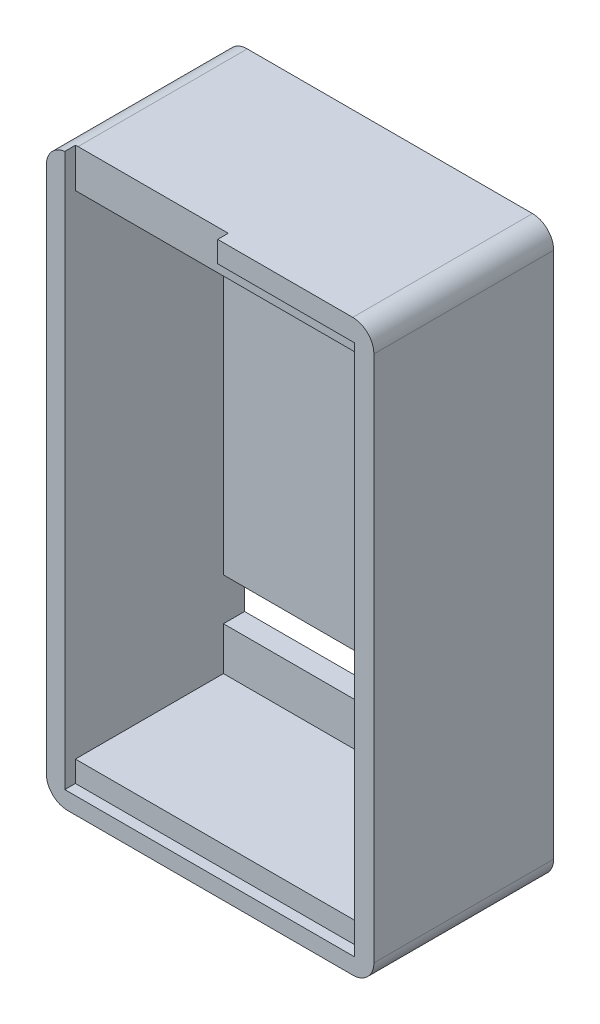
ISO-10303-21;
HEADER;
FILE_DESCRIPTION(('STEP AP214'),'2;1');
FILE_NAME('part.step','',(''),(''),'','','');
FILE_SCHEMA(('AUTOMOTIVE_DESIGN { 1 0 10303 214 1 1 1 1 }'));
ENDSEC;
DATA;
#1=APPLICATION_CONTEXT('core data for automotive mechanical design processes');
#2=APPLICATION_PROTOCOL_DEFINITION('international standard','automotive_design',2000,#1);
#3=PRODUCT_CONTEXT('',#1,'mechanical');
#4=PRODUCT('Part','Part','',(#3));
#5=PRODUCT_RELATED_PRODUCT_CATEGORY('part','',(#4));
#6=PRODUCT_DEFINITION_FORMATION('','',#4);
#7=PRODUCT_DEFINITION_CONTEXT('part definition',#1,'design');
#8=PRODUCT_DEFINITION('design','',#6,#7);
#9=PRODUCT_DEFINITION_SHAPE('','',#8);
#10=(LENGTH_UNIT() NAMED_UNIT(*) SI_UNIT(.MILLI.,.METRE.));
#11=(NAMED_UNIT(*) PLANE_ANGLE_UNIT() SI_UNIT($,.RADIAN.));
#12=(NAMED_UNIT(*) SI_UNIT($,.STERADIAN.) SOLID_ANGLE_UNIT());
#13=UNCERTAINTY_MEASURE_WITH_UNIT(LENGTH_MEASURE(1.E-05),#10,'distance_accuracy_value','');
#14=(GEOMETRIC_REPRESENTATION_CONTEXT(3) GLOBAL_UNCERTAINTY_ASSIGNED_CONTEXT((#13)) GLOBAL_UNIT_ASSIGNED_CONTEXT((#10,
#11,#12)) REPRESENTATION_CONTEXT('',''));
#15=CARTESIAN_POINT('',(0.,0.,0.));
#16=DIRECTION('',(0.,0.,1.));
#17=DIRECTION('',(1.,0.,0.));
#18=AXIS2_PLACEMENT_3D('',#15,#16,#17);
#19=CARTESIAN_POINT('',(0.,0.,2.));
#20=DIRECTION('',(0.,0.,-1.));
#21=DIRECTION('',(-1.,0.,0.));
#22=AXIS2_PLACEMENT_3D('',#19,#20,#21);
#23=PLANE('',#22);
#24=DIRECTION('',(1.,0.,0.));
#25=VECTOR('',#24,1.);
#26=CARTESIAN_POINT('',(38.4138867747377,-36.8271145490556,2.));
#27=LINE('',#26,#25);
#28=CARTESIAN_POINT('',(38.4138867747377,-36.8271145490556,2.));
#29=VERTEX_POINT('',#28);
#30=CARTESIAN_POINT('',(65.7954731172423,-36.8271145490556,2.));
#31=VERTEX_POINT('',#30);
#32=EDGE_CURVE('E213',#29,#31,#27,.T.);
#33=ORIENTED_EDGE('',*,*,#32,.F.);
#34=DIRECTION('',(0.,-1.,0.));
#35=VECTOR('',#34,1.);
#36=CARTESIAN_POINT('',(38.4138867747377,-77.1753131264585,2.));
#37=LINE('',#36,#35);
#38=CARTESIAN_POINT('',(38.4138867747377,-67.0903285254417,2.));
#39=VERTEX_POINT('',#38);
#40=EDGE_CURVE('E225',#29,#39,#37,.T.);
#41=ORIENTED_EDGE('',*,*,#40,.T.);
#42=DIRECTION('',(-1.,0.,0.));
#43=VECTOR('',#42,1.);
#44=CARTESIAN_POINT('',(38.4138867747377,-67.0903285254417,2.));
#45=LINE('',#44,#43);
#46=CARTESIAN_POINT('',(65.7954731172423,-67.0903285254417,2.));
#47=VERTEX_POINT('',#46);
#48=EDGE_CURVE('E354',#47,#39,#45,.T.);
#49=ORIENTED_EDGE('',*,*,#48,.F.);
#50=DIRECTION('',(0.,1.,0.));
#51=VECTOR('',#50,1.);
#52=CARTESIAN_POINT('',(65.7954731172423,-26.6161419497379,2.));
#53=LINE('',#52,#51);
#54=EDGE_CURVE('E227',#47,#31,#53,.T.);
#55=ORIENTED_EDGE('',*,*,#54,.T.);
#56=EDGE_LOOP('',(#33,#41,#49,#55));
#57=FACE_BOUND('',#56,.T.);
#58=ADVANCED_FACE('F35',(#57),#23,.F.);
#59=DIRECTION('',(-1.,0.,0.));
#60=VECTOR('',#59,1.);
#61=CARTESIAN_POINT('',(38.4138867747377,-32.8271145490556,2.));
#62=LINE('',#61,#60);
#63=CARTESIAN_POINT('',(65.7954731172423,-32.8271145490556,2.));
#64=VERTEX_POINT('',#63);
#65=CARTESIAN_POINT('',(38.4138867747377,-32.8271145490556,2.));
#66=VERTEX_POINT('',#65);
#67=EDGE_CURVE('E220',#64,#66,#62,.T.);
#68=ORIENTED_EDGE('',*,*,#67,.F.);
#69=CARTESIAN_POINT('',(65.7954731172423,-28.6161419497379,2.));
#70=VERTEX_POINT('',#69);
#71=EDGE_CURVE('E252',#64,#70,#53,.T.);
#72=ORIENTED_EDGE('',*,*,#71,.T.);
#73=DIRECTION('',(1.,0.,0.));
#74=VECTOR('',#73,1.);
#75=CARTESIAN_POINT('',(38.4138867747377,-28.6161419497379,2.));
#76=LINE('',#75,#74);
#77=CARTESIAN_POINT('',(38.4138867747377,-28.6161419497379,2.));
#78=VERTEX_POINT('',#77);
#79=EDGE_CURVE('E407',#78,#70,#76,.T.);
#80=ORIENTED_EDGE('',*,*,#79,.F.);
#81=EDGE_CURVE('E235',#78,#66,#37,.T.);
#82=ORIENTED_EDGE('',*,*,#81,.T.);
#83=EDGE_LOOP('',(#68,#72,#80,#82));
#84=FACE_BOUND('',#83,.T.);
#85=ADVANCED_FACE('F428',(#84),#23,.F.);
#86=DIRECTION('',(1.,0.,0.));
#87=VECTOR('',#86,1.);
#88=CARTESIAN_POINT('',(38.4138867747377,-71.0903285254417,2.));
#89=LINE('',#88,#87);
#90=CARTESIAN_POINT('',(38.4138867747377,-71.0903285254417,2.));
#91=VERTEX_POINT('',#90);
#92=CARTESIAN_POINT('',(65.7954731172423,-71.0903285254417,2.));
#93=VERTEX_POINT('',#92);
#94=EDGE_CURVE('E356',#91,#93,#89,.T.);
#95=ORIENTED_EDGE('',*,*,#94,.F.);
#96=CARTESIAN_POINT('',(38.4138867747377,-75.1753131264585,2.));
#97=VERTEX_POINT('',#96);
#98=EDGE_CURVE('E236',#91,#97,#37,.T.);
#99=ORIENTED_EDGE('',*,*,#98,.T.);
#100=DIRECTION('',(-1.,0.,0.));
#101=VECTOR('',#100,1.);
#102=CARTESIAN_POINT('',(38.4138867747377,-75.1753131264585,2.));
#103=LINE('',#102,#101);
#104=CARTESIAN_POINT('',(65.7954731172423,-75.1753131264585,2.));
#105=VERTEX_POINT('',#104);
#106=EDGE_CURVE('E386',#105,#97,#103,.T.);
#107=ORIENTED_EDGE('',*,*,#106,.F.);
#108=EDGE_CURVE('E240',#105,#93,#53,.T.);
#109=ORIENTED_EDGE('',*,*,#108,.T.);
#110=EDGE_LOOP('',(#95,#99,#107,#109));
#111=FACE_BOUND('',#110,.T.);
#112=ADVANCED_FACE('F457',(#111),#23,.F.);
#113=CARTESIAN_POINT('',(65.7954731172423,-26.6161419497379,2.));
#114=DIRECTION('',(1.,0.,0.));
#115=DIRECTION('',(0.,0.,-1.));
#116=AXIS2_PLACEMENT_3D('',#113,#114,#115);
#117=PLANE('',#116);
#118=DIRECTION('',(0.,0.,1.));
#119=VECTOR('',#118,1.);
#120=CARTESIAN_POINT('',(65.7954731172423,-26.8876513413796,2.));
#121=LINE('',#120,#119);
#122=CARTESIAN_POINT('',(65.7954731172423,-26.8876513413796,16.));
#123=VERTEX_POINT('',#122);
#124=CARTESIAN_POINT('',(65.7954731172423,-26.8876513413796,17.));
#125=VERTEX_POINT('',#124);
#126=EDGE_CURVE('E374',#123,#125,#121,.T.);
#127=ORIENTED_EDGE('',*,*,#126,.F.);
#128=DIRECTION('',(0.,1.,0.));
#129=VECTOR('',#128,1.);
#130=CARTESIAN_POINT('',(65.7954731172423,-26.6161419497379,16.));
#131=LINE('',#130,#129);
#132=CARTESIAN_POINT('',(65.7954731172423,-28.6161419497379,16.));
#133=VERTEX_POINT('',#132);
#134=EDGE_CURVE('E413',#133,#123,#131,.T.);
#135=ORIENTED_EDGE('',*,*,#134,.F.);
#136=DIRECTION('',(0.,0.,-1.));
#137=VECTOR('',#136,1.);
#138=CARTESIAN_POINT('',(65.7954731172423,-28.6161419497379,16.));
#139=LINE('',#138,#137);
#140=EDGE_CURVE('E416',#133,#70,#139,.T.);
#141=ORIENTED_EDGE('',*,*,#140,.T.);
#142=ORIENTED_EDGE('',*,*,#71,.F.);
#143=DIRECTION('',(0.,0.,1.));
#144=VECTOR('',#143,1.);
#145=CARTESIAN_POINT('',(65.7954731172423,-32.8271145490556,-8.));
#146=LINE('',#145,#144);
#147=CARTESIAN_POINT('',(65.7954731172423,-32.8271145490556,0.));
#148=VERTEX_POINT('',#147);
#149=EDGE_CURVE('E58',#148,#64,#146,.T.);
#150=ORIENTED_EDGE('',*,*,#149,.F.);
#151=DIRECTION('',(0.,1.,0.));
#152=VECTOR('',#151,1.);
#153=CARTESIAN_POINT('',(65.7954731172423,0.,0.));
#154=LINE('',#153,#152);
#155=CARTESIAN_POINT('',(65.7954731172423,-36.8271145490556,0.));
#156=VERTEX_POINT('',#155);
#157=EDGE_CURVE('E334',#156,#148,#154,.T.);
#158=ORIENTED_EDGE('',*,*,#157,.F.);
#159=DIRECTION('',(0.,0.,1.));
#160=VECTOR('',#159,1.);
#161=CARTESIAN_POINT('',(65.7954731172423,-36.8271145490556,-8.));
#162=LINE('',#161,#160);
#163=EDGE_CURVE('E219',#156,#31,#162,.T.);
#164=ORIENTED_EDGE('',*,*,#163,.T.);
#165=ORIENTED_EDGE('',*,*,#54,.F.);
#166=DIRECTION('',(0.,0.,1.));
#167=VECTOR('',#166,1.);
#168=CARTESIAN_POINT('',(65.7954731172423,-67.0903285254417,-8.));
#169=LINE('',#168,#167);
#170=CARTESIAN_POINT('',(65.7954731172423,-67.0903285254417,0.));
#171=VERTEX_POINT('',#170);
#172=EDGE_CURVE('E358',#171,#47,#169,.T.);
#173=ORIENTED_EDGE('',*,*,#172,.F.);
#174=DIRECTION('',(0.,1.,0.));
#175=VECTOR('',#174,1.);
#176=CARTESIAN_POINT('',(65.7954731172423,0.,0.));
#177=LINE('',#176,#175);
#178=CARTESIAN_POINT('',(65.7954731172423,-71.0903285254417,0.));
#179=VERTEX_POINT('',#178);
#180=EDGE_CURVE('E330',#179,#171,#177,.T.);
#181=ORIENTED_EDGE('',*,*,#180,.F.);
#182=DIRECTION('',(0.,0.,1.));
#183=VECTOR('',#182,1.);
#184=CARTESIAN_POINT('',(65.7954731172423,-71.0903285254417,-8.));
#185=LINE('',#184,#183);
#186=EDGE_CURVE('E228',#179,#93,#185,.T.);
#187=ORIENTED_EDGE('',*,*,#186,.T.);
#188=ORIENTED_EDGE('',*,*,#108,.F.);
#189=DIRECTION('',(0.,0.,-1.));
#190=VECTOR('',#189,1.);
#191=CARTESIAN_POINT('',(65.7954731172423,-75.1753131264585,16.));
#192=LINE('',#191,#190);
#193=CARTESIAN_POINT('',(65.7954731172423,-75.1753131264585,16.));
#194=VERTEX_POINT('',#193);
#195=EDGE_CURVE('E404',#194,#105,#192,.T.);
#196=ORIENTED_EDGE('',*,*,#195,.F.);
#197=DIRECTION('',(0.,1.,0.));
#198=VECTOR('',#197,1.);
#199=CARTESIAN_POINT('',(65.7954731172423,-77.1753131264585,16.));
#200=LINE('',#199,#198);
#201=CARTESIAN_POINT('',(65.7954731172423,-77.1753131264585,16.));
#202=VERTEX_POINT('',#201);
#203=EDGE_CURVE('E393',#202,#194,#200,.T.);
#204=ORIENTED_EDGE('',*,*,#203,.F.);
#205=DIRECTION('',(0.,0.,1.));
#206=VECTOR('',#205,1.);
#207=CARTESIAN_POINT('',(65.7954731172423,-77.1753131264585,2.));
#208=LINE('',#207,#206);
#209=CARTESIAN_POINT('',(65.7954731172423,-77.1753131264585,17.));
#210=VERTEX_POINT('',#209);
#211=EDGE_CURVE('E253',#202,#210,#208,.T.);
#212=ORIENTED_EDGE('',*,*,#211,.T.);
#213=DIRECTION('',(0.,1.,0.));
#214=VECTOR('',#213,1.);
#215=CARTESIAN_POINT('',(65.7954731172423,-26.6161419497379,17.));
#216=LINE('',#215,#214);
#217=EDGE_CURVE('E244',#210,#125,#216,.T.);
#218=ORIENTED_EDGE('',*,*,#217,.T.);
#219=EDGE_LOOP('',(#127,#135,#141,#142,#150,#158,#164,#165,#173,#181,#187,#188,#196,#204,#212,#218));
#220=FACE_BOUND('',#219,.T.);
#221=ADVANCED_FACE('F346',(#220),#117,.F.);
#222=CARTESIAN_POINT('',(0.,0.,16.));
#223=DIRECTION('',(0.,0.,1.));
#224=DIRECTION('',(1.,0.,0.));
#225=AXIS2_PLACEMENT_3D('',#222,#223,#224);
#226=PLANE('',#225);
#227=DIRECTION('',(-1.,0.,0.));
#228=VECTOR('',#227,1.);
#229=CARTESIAN_POINT('',(38.4138867747377,-24.8876513413796,16.));
#230=LINE('',#229,#228);
#231=CARTESIAN_POINT('',(52.8696418024731,-24.8876513413796,16.));
#232=VERTEX_POINT('',#231);
#233=CARTESIAN_POINT('',(38.6667067876056,-24.8876513413796,16.));
#234=VERTEX_POINT('',#233);
#235=EDGE_CURVE('E383',#232,#234,#230,.T.);
#236=ORIENTED_EDGE('',*,*,#235,.T.);
#237=CARTESIAN_POINT('',(38.6667067876056,-26.8876513413796,16.));
#238=DIRECTION('',(0.,0.,1.));
#239=DIRECTION('',(1.,0.,0.));
#240=AXIS2_PLACEMENT_3D('',#237,#238,#239);
#241=CIRCLE('',#240,2.);
#242=CARTESIAN_POINT('',(38.4138867747377,-24.9036951823142,16.));
#243=VERTEX_POINT('',#242);
#244=EDGE_CURVE('E317',#234,#243,#241,.T.);
#245=ORIENTED_EDGE('',*,*,#244,.T.);
#246=DIRECTION('',(0.,-1.,0.));
#247=VECTOR('',#246,1.);
#248=CARTESIAN_POINT('',(38.4138867747377,-26.6161419497379,16.));
#249=LINE('',#248,#247);
#250=CARTESIAN_POINT('',(38.4138867747377,-28.6161419497379,16.));
#251=VERTEX_POINT('',#250);
#252=EDGE_CURVE('E408',#243,#251,#249,.T.);
#253=ORIENTED_EDGE('',*,*,#252,.T.);
#254=DIRECTION('',(1.,0.,0.));
#255=VECTOR('',#254,1.);
#256=CARTESIAN_POINT('',(38.4138867747377,-28.6161419497379,16.));
#257=LINE('',#256,#255);
#258=EDGE_CURVE('E410',#251,#133,#257,.T.);
#259=ORIENTED_EDGE('',*,*,#258,.T.);
#260=ORIENTED_EDGE('',*,*,#134,.T.);
#261=DIRECTION('',(1.,0.,0.));
#262=VECTOR('',#261,1.);
#263=CARTESIAN_POINT('',(65.8048441622965,-26.8876513413796,16.));
#264=LINE('',#263,#262);
#265=CARTESIAN_POINT('',(52.8696418024731,-26.8876513413796,16.));
#266=VERTEX_POINT('',#265);
#267=EDGE_CURVE('E363',#266,#123,#264,.T.);
#268=ORIENTED_EDGE('',*,*,#267,.F.);
#269=DIRECTION('',(0.,-1.,0.));
#270=VECTOR('',#269,1.);
#271=CARTESIAN_POINT('',(52.8696418024731,-24.8876513413796,16.));
#272=LINE('',#271,#270);
#273=EDGE_CURVE('E368',#232,#266,#272,.T.);
#274=ORIENTED_EDGE('',*,*,#273,.F.);
#275=EDGE_LOOP('',(#236,#245,#253,#259,#260,#268,#274));
#276=FACE_BOUND('',#275,.T.);
#277=ADVANCED_FACE('F430',(#276),#226,.T.);
#278=CARTESIAN_POINT('',(38.4138867747377,-77.1753131264585,2.));
#279=DIRECTION('',(-1.,0.,0.));
#280=DIRECTION('',(0.,0.,1.));
#281=AXIS2_PLACEMENT_3D('',#278,#279,#280);
#282=PLANE('',#281);
#283=ORIENTED_EDGE('',*,*,#252,.F.);
#284=DIRECTION('',(0.,0.,-1.));
#285=VECTOR('',#284,1.);
#286=CARTESIAN_POINT('',(38.4138867747377,-24.9036951823142,16.));
#287=LINE('',#286,#285);
#288=CARTESIAN_POINT('',(38.4138867747377,-24.9036951823142,17.));
#289=VERTEX_POINT('',#288);
#290=EDGE_CURVE('E319',#243,#289,#287,.F.);
#291=ORIENTED_EDGE('',*,*,#290,.T.);
#292=DIRECTION('',(0.,-1.,0.));
#293=VECTOR('',#292,1.);
#294=CARTESIAN_POINT('',(38.4138867747377,-77.1753131264585,17.));
#295=LINE('',#294,#293);
#296=CARTESIAN_POINT('',(38.4138867747377,-77.1753131264585,17.));
#297=VERTEX_POINT('',#296);
#298=EDGE_CURVE('E246',#289,#297,#295,.T.);
#299=ORIENTED_EDGE('',*,*,#298,.T.);
#300=DIRECTION('',(0.,0.,1.));
#301=VECTOR('',#300,1.);
#302=CARTESIAN_POINT('',(38.4138867747377,-77.1753131264585,2.));
#303=LINE('',#302,#301);
#304=CARTESIAN_POINT('',(38.4138867747377,-77.1753131264585,16.));
#305=VERTEX_POINT('',#304);
#306=EDGE_CURVE('E239',#305,#297,#303,.T.);
#307=ORIENTED_EDGE('',*,*,#306,.F.);
#308=DIRECTION('',(0.,-1.,0.));
#309=VECTOR('',#308,1.);
#310=CARTESIAN_POINT('',(38.4138867747377,-77.1753131264585,16.));
#311=LINE('',#310,#309);
#312=CARTESIAN_POINT('',(38.4138867747377,-75.1753131264585,16.));
#313=VERTEX_POINT('',#312);
#314=EDGE_CURVE('E387',#313,#305,#311,.T.);
#315=ORIENTED_EDGE('',*,*,#314,.F.);
#316=DIRECTION('',(0.,0.,-1.));
#317=VECTOR('',#316,1.);
#318=CARTESIAN_POINT('',(38.4138867747377,-75.1753131264585,16.));
#319=LINE('',#318,#317);
#320=EDGE_CURVE('E399',#313,#97,#319,.T.);
#321=ORIENTED_EDGE('',*,*,#320,.T.);
#322=ORIENTED_EDGE('',*,*,#98,.F.);
#323=DIRECTION('',(0.,0.,1.));
#324=VECTOR('',#323,1.);
#325=CARTESIAN_POINT('',(38.4138867747377,-71.0903285254417,-8.));
#326=LINE('',#325,#324);
#327=CARTESIAN_POINT('',(38.4138867747377,-71.0903285254417,0.));
#328=VERTEX_POINT('',#327);
#329=EDGE_CURVE('E50',#328,#91,#326,.T.);
#330=ORIENTED_EDGE('',*,*,#329,.F.);
#331=DIRECTION('',(0.,-1.,0.));
#332=VECTOR('',#331,1.);
#333=CARTESIAN_POINT('',(38.4138867747377,0.,0.));
#334=LINE('',#333,#332);
#335=CARTESIAN_POINT('',(38.4138867747377,-67.0903285254417,0.));
#336=VERTEX_POINT('',#335);
#337=EDGE_CURVE('E324',#336,#328,#334,.T.);
#338=ORIENTED_EDGE('',*,*,#337,.F.);
#339=DIRECTION('',(0.,0.,1.));
#340=VECTOR('',#339,1.);
#341=CARTESIAN_POINT('',(38.4138867747377,-67.0903285254417,-8.));
#342=LINE('',#341,#340);
#343=EDGE_CURVE('E233',#336,#39,#342,.T.);
#344=ORIENTED_EDGE('',*,*,#343,.T.);
#345=ORIENTED_EDGE('',*,*,#40,.F.);
#346=DIRECTION('',(0.,0.,1.));
#347=VECTOR('',#346,1.);
#348=CARTESIAN_POINT('',(38.4138867747377,-36.8271145490556,-8.));
#349=LINE('',#348,#347);
#350=CARTESIAN_POINT('',(38.4138867747377,-36.8271145490556,0.));
#351=VERTEX_POINT('',#350);
#352=EDGE_CURVE('E210',#351,#29,#349,.T.);
#353=ORIENTED_EDGE('',*,*,#352,.F.);
#354=DIRECTION('',(0.,-1.,0.));
#355=VECTOR('',#354,1.);
#356=CARTESIAN_POINT('',(38.4138867747377,0.,0.));
#357=LINE('',#356,#355);
#358=CARTESIAN_POINT('',(38.4138867747377,-32.8271145490556,0.));
#359=VERTEX_POINT('',#358);
#360=EDGE_CURVE('E11',#359,#351,#357,.T.);
#361=ORIENTED_EDGE('',*,*,#360,.F.);
#362=DIRECTION('',(0.,0.,1.));
#363=VECTOR('',#362,1.);
#364=CARTESIAN_POINT('',(38.4138867747377,-32.8271145490556,-8.));
#365=LINE('',#364,#363);
#366=EDGE_CURVE('E343',#359,#66,#365,.T.);
#367=ORIENTED_EDGE('',*,*,#366,.T.);
#368=ORIENTED_EDGE('',*,*,#81,.F.);
#369=DIRECTION('',(0.,0.,-1.));
#370=VECTOR('',#369,1.);
#371=CARTESIAN_POINT('',(38.4138867747377,-28.6161419497379,16.));
#372=LINE('',#371,#370);
#373=EDGE_CURVE('E247',#251,#78,#372,.T.);
#374=ORIENTED_EDGE('',*,*,#373,.F.);
#375=EDGE_LOOP('',(#283,#291,#299,#307,#315,#321,#322,#330,#338,#344,#345,#353,#361,#367,#368,#374));
#376=FACE_BOUND('',#375,.T.);
#377=ADVANCED_FACE('F231',(#376),#282,.F.);
#378=CARTESIAN_POINT('',(65.7954731172423,-77.1753131264585,2.));
#379=DIRECTION('',(0.,-1.,0.));
#380=DIRECTION('',(0.,0.,-1.));
#381=AXIS2_PLACEMENT_3D('',#378,#379,#380);
#382=PLANE('',#381);
#383=DIRECTION('',(1.,0.,0.));
#384=VECTOR('',#383,1.);
#385=CARTESIAN_POINT('',(38.4138867747377,-77.1753131264585,16.));
#386=LINE('',#385,#384);
#387=EDGE_CURVE('E390',#305,#202,#386,.T.);
#388=ORIENTED_EDGE('',*,*,#387,.F.);
#389=ORIENTED_EDGE('',*,*,#306,.T.);
#390=DIRECTION('',(1.,0.,0.));
#391=VECTOR('',#390,1.);
#392=CARTESIAN_POINT('',(65.7954731172423,-77.1753131264585,17.));
#393=LINE('',#392,#391);
#394=EDGE_CURVE('E249',#297,#210,#393,.T.);
#395=ORIENTED_EDGE('',*,*,#394,.T.);
#396=ORIENTED_EDGE('',*,*,#211,.F.);
#397=EDGE_LOOP('',(#388,#389,#395,#396));
#398=FACE_BOUND('',#397,.T.);
#399=ADVANCED_FACE('F447',(#398),#382,.F.);
#400=CARTESIAN_POINT('',(36.6667067876056,0.,17.));
#401=DIRECTION('',(-1.,0.,0.));
#402=DIRECTION('',(0.,0.,1.));
#403=AXIS2_PLACEMENT_3D('',#400,#401,#402);
#404=PLANE('',#403);
#405=DIRECTION('',(0.,1.,0.));
#406=VECTOR('',#405,1.);
#407=CARTESIAN_POINT('',(36.6667067876056,0.,0.));
#408=LINE('',#407,#406);
#409=CARTESIAN_POINT('',(36.6667067876056,-76.7564287427443,0.));
#410=VERTEX_POINT('',#409);
#411=CARTESIAN_POINT('',(36.6667067876056,-26.8876513413796,0.));
#412=VERTEX_POINT('',#411);
#413=EDGE_CURVE('E255',#410,#412,#408,.T.);
#414=ORIENTED_EDGE('',*,*,#413,.F.);
#415=DIRECTION('',(0.,0.,-1.));
#416=VECTOR('',#415,1.);
#417=CARTESIAN_POINT('',(36.6667067876056,-76.7564287427443,17.));
#418=LINE('',#417,#416);
#419=CARTESIAN_POINT('',(36.6667067876056,-76.7564287427443,17.));
#420=VERTEX_POINT('',#419);
#421=EDGE_CURVE('E310',#410,#420,#418,.F.);
#422=ORIENTED_EDGE('',*,*,#421,.T.);
#423=DIRECTION('',(0.,1.,0.));
#424=VECTOR('',#423,1.);
#425=CARTESIAN_POINT('',(36.6667067876056,0.,17.));
#426=LINE('',#425,#424);
#427=CARTESIAN_POINT('',(36.6667067876056,-26.8876513413796,17.));
#428=VERTEX_POINT('',#427);
#429=EDGE_CURVE('E258',#420,#428,#426,.T.);
#430=ORIENTED_EDGE('',*,*,#429,.T.);
#431=DIRECTION('',(0.,0.,-1.));
#432=VECTOR('',#431,1.);
#433=CARTESIAN_POINT('',(36.6667067876056,-26.8876513413796,17.));
#434=LINE('',#433,#432);
#435=EDGE_CURVE('E307',#428,#412,#434,.T.);
#436=ORIENTED_EDGE('',*,*,#435,.T.);
#437=EDGE_LOOP('',(#414,#422,#430,#436));
#438=FACE_BOUND('',#437,.T.);
#439=ADVANCED_FACE('F508',(#438),#404,.T.);
#440=CARTESIAN_POINT('',(0.,-78.7564287427443,17.));
#441=DIRECTION('',(0.,-1.,0.));
#442=DIRECTION('',(0.,0.,-1.));
#443=AXIS2_PLACEMENT_3D('',#440,#441,#442);
#444=PLANE('',#443);
#445=DIRECTION('',(-1.,0.,0.));
#446=VECTOR('',#445,1.);
#447=CARTESIAN_POINT('',(0.,-78.7564287427443,0.));
#448=LINE('',#447,#446);
#449=CARTESIAN_POINT('',(65.6413600769126,-78.7564287427443,0.));
#450=VERTEX_POINT('',#449);
#451=CARTESIAN_POINT('',(38.6667067876056,-78.7564287427443,0.));
#452=VERTEX_POINT('',#451);
#453=EDGE_CURVE('E274',#450,#452,#448,.T.);
#454=ORIENTED_EDGE('',*,*,#453,.F.);
#455=DIRECTION('',(0.,0.,-1.));
#456=VECTOR('',#455,1.);
#457=CARTESIAN_POINT('',(65.6413600769126,-78.7564287427443,17.));
#458=LINE('',#457,#456);
#459=CARTESIAN_POINT('',(65.6413600769126,-78.7564287427443,17.));
#460=VERTEX_POINT('',#459);
#461=EDGE_CURVE('E297',#450,#460,#458,.F.);
#462=ORIENTED_EDGE('',*,*,#461,.T.);
#463=DIRECTION('',(-1.,0.,0.));
#464=VECTOR('',#463,1.);
#465=CARTESIAN_POINT('',(0.,-78.7564287427443,17.));
#466=LINE('',#465,#464);
#467=CARTESIAN_POINT('',(38.6667067876056,-78.7564287427443,17.));
#468=VERTEX_POINT('',#467);
#469=EDGE_CURVE('E261',#460,#468,#466,.T.);
#470=ORIENTED_EDGE('',*,*,#469,.T.);
#471=DIRECTION('',(0.,0.,-1.));
#472=VECTOR('',#471,1.);
#473=CARTESIAN_POINT('',(38.6667067876056,-78.7564287427443,17.));
#474=LINE('',#473,#472);
#475=EDGE_CURVE('E294',#468,#452,#474,.T.);
#476=ORIENTED_EDGE('',*,*,#475,.T.);
#477=EDGE_LOOP('',(#454,#462,#470,#476));
#478=FACE_BOUND('',#477,.T.);
#479=ADVANCED_FACE('F504',(#478),#444,.T.);
#480=CARTESIAN_POINT('',(67.6413600769126,0.,17.));
#481=DIRECTION('',(1.,0.,0.));
#482=DIRECTION('',(0.,0.,-1.));
#483=AXIS2_PLACEMENT_3D('',#480,#481,#482);
#484=PLANE('',#483);
#485=DIRECTION('',(0.,-1.,0.));
#486=VECTOR('',#485,1.);
#487=CARTESIAN_POINT('',(67.6413600769126,0.,17.));
#488=LINE('',#487,#486);
#489=CARTESIAN_POINT('',(67.6413600769126,-26.8876513413796,17.));
#490=VERTEX_POINT('',#489);
#491=CARTESIAN_POINT('',(67.6413600769126,-76.7564287427443,17.));
#492=VERTEX_POINT('',#491);
#493=EDGE_CURVE('E265',#490,#492,#488,.T.);
#494=ORIENTED_EDGE('',*,*,#493,.T.);
#495=DIRECTION('',(0.,0.,-1.));
#496=VECTOR('',#495,1.);
#497=CARTESIAN_POINT('',(67.6413600769126,-76.7564287427443,17.));
#498=LINE('',#497,#496);
#499=CARTESIAN_POINT('',(67.6413600769126,-76.7564287427443,0.));
#500=VERTEX_POINT('',#499);
#501=EDGE_CURVE('E283',#492,#500,#498,.T.);
#502=ORIENTED_EDGE('',*,*,#501,.T.);
#503=DIRECTION('',(0.,-1.,0.));
#504=VECTOR('',#503,1.);
#505=CARTESIAN_POINT('',(67.6413600769126,0.,0.));
#506=LINE('',#505,#504);
#507=CARTESIAN_POINT('',(67.6413600769126,-26.8876513413796,0.));
#508=VERTEX_POINT('',#507);
#509=EDGE_CURVE('E277',#508,#500,#506,.T.);
#510=ORIENTED_EDGE('',*,*,#509,.F.);
#511=DIRECTION('',(0.,0.,-1.));
#512=VECTOR('',#511,1.);
#513=CARTESIAN_POINT('',(67.6413600769126,-26.8876513413796,17.));
#514=LINE('',#513,#512);
#515=EDGE_CURVE('E271',#508,#490,#514,.F.);
#516=ORIENTED_EDGE('',*,*,#515,.T.);
#517=EDGE_LOOP('',(#494,#502,#510,#516));
#518=FACE_BOUND('',#517,.T.);
#519=ADVANCED_FACE('F500',(#518),#484,.T.);
#520=CARTESIAN_POINT('',(0.,-24.8876513413796,17.));
#521=DIRECTION('',(0.,1.,0.));
#522=DIRECTION('',(0.,0.,1.));
#523=AXIS2_PLACEMENT_3D('',#520,#521,#522);
#524=PLANE('',#523);
#525=DIRECTION('',(1.,0.,0.));
#526=VECTOR('',#525,1.);
#527=CARTESIAN_POINT('',(0.,-24.8876513413796,0.));
#528=LINE('',#527,#526);
#529=CARTESIAN_POINT('',(38.6667067876056,-24.8876513413796,0.));
#530=VERTEX_POINT('',#529);
#531=CARTESIAN_POINT('',(65.6413600769126,-24.8876513413796,0.));
#532=VERTEX_POINT('',#531);
#533=EDGE_CURVE('E262',#530,#532,#528,.T.);
#534=ORIENTED_EDGE('',*,*,#533,.F.);
#535=DIRECTION('',(0.,0.,-1.));
#536=VECTOR('',#535,1.);
#537=CARTESIAN_POINT('',(38.6667067876056,-24.8876513413796,17.));
#538=LINE('',#537,#536);
#539=EDGE_CURVE('E315',#530,#234,#538,.F.);
#540=ORIENTED_EDGE('',*,*,#539,.T.);
#541=ORIENTED_EDGE('',*,*,#235,.F.);
#542=DIRECTION('',(0.,0.,-1.));
#543=VECTOR('',#542,1.);
#544=CARTESIAN_POINT('',(52.8696418024731,-24.8876513413796,30.0889059928468));
#545=LINE('',#544,#543);
#546=CARTESIAN_POINT('',(52.8696418024731,-24.8876513413796,17.));
#547=VERTEX_POINT('',#546);
#548=EDGE_CURVE('E349',#547,#232,#545,.T.);
#549=ORIENTED_EDGE('',*,*,#548,.F.);
#550=DIRECTION('',(1.,0.,0.));
#551=VECTOR('',#550,1.);
#552=CARTESIAN_POINT('',(0.,-24.8876513413796,17.));
#553=LINE('',#552,#551);
#554=CARTESIAN_POINT('',(65.6413600769126,-24.8876513413796,17.));
#555=VERTEX_POINT('',#554);
#556=EDGE_CURVE('E268',#547,#555,#553,.T.);
#557=ORIENTED_EDGE('',*,*,#556,.T.);
#558=DIRECTION('',(0.,0.,-1.));
#559=VECTOR('',#558,1.);
#560=CARTESIAN_POINT('',(65.6413600769126,-24.8876513413796,17.));
#561=LINE('',#560,#559);
#562=EDGE_CURVE('E312',#555,#532,#561,.T.);
#563=ORIENTED_EDGE('',*,*,#562,.T.);
#564=EDGE_LOOP('',(#534,#540,#541,#549,#557,#563));
#565=FACE_BOUND('',#564,.T.);
#566=ADVANCED_FACE('F495',(#565),#524,.T.);
#567=CARTESIAN_POINT('',(0.,0.,17.));
#568=DIRECTION('',(0.,0.,1.));
#569=DIRECTION('',(1.,0.,0.));
#570=AXIS2_PLACEMENT_3D('',#567,#568,#569);
#571=PLANE('',#570);
#572=ORIENTED_EDGE('',*,*,#469,.F.);
#573=CARTESIAN_POINT('',(65.6413600769126,-76.7564287427443,17.));
#574=DIRECTION('',(0.,0.,1.));
#575=DIRECTION('',(1.,0.,0.));
#576=AXIS2_PLACEMENT_3D('',#573,#574,#575);
#577=CIRCLE('',#576,2.);
#578=EDGE_CURVE('E305',#460,#492,#577,.T.);
#579=ORIENTED_EDGE('',*,*,#578,.T.);
#580=ORIENTED_EDGE('',*,*,#493,.F.);
#581=CARTESIAN_POINT('',(65.6413600769126,-26.8876513413796,17.));
#582=DIRECTION('',(0.,0.,1.));
#583=DIRECTION('',(1.,0.,0.));
#584=AXIS2_PLACEMENT_3D('',#581,#582,#583);
#585=CIRCLE('',#584,2.);
#586=EDGE_CURVE('E299',#490,#555,#585,.T.);
#587=ORIENTED_EDGE('',*,*,#586,.T.);
#588=ORIENTED_EDGE('',*,*,#556,.F.);
#589=DIRECTION('',(0.,-1.,0.));
#590=VECTOR('',#589,1.);
#591=CARTESIAN_POINT('',(52.8696418024731,-24.8876513413796,17.));
#592=LINE('',#591,#590);
#593=CARTESIAN_POINT('',(52.8696418024731,-26.8876513413796,17.));
#594=VERTEX_POINT('',#593);
#595=EDGE_CURVE('E371',#547,#594,#592,.T.);
#596=ORIENTED_EDGE('',*,*,#595,.T.);
#597=DIRECTION('',(1.,0.,0.));
#598=VECTOR('',#597,1.);
#599=CARTESIAN_POINT('',(65.8048441622965,-26.8876513413796,17.));
#600=LINE('',#599,#598);
#601=EDGE_CURVE('E366',#594,#125,#600,.T.);
#602=ORIENTED_EDGE('',*,*,#601,.T.);
#603=ORIENTED_EDGE('',*,*,#217,.F.);
#604=ORIENTED_EDGE('',*,*,#394,.F.);
#605=ORIENTED_EDGE('',*,*,#298,.F.);
#606=CARTESIAN_POINT('',(38.6667067876056,-26.8876513413796,17.));
#607=DIRECTION('',(0.,0.,1.));
#608=DIRECTION('',(1.,0.,0.));
#609=AXIS2_PLACEMENT_3D('',#606,#607,#608);
#610=CIRCLE('',#609,2.);
#611=EDGE_CURVE('E301',#289,#428,#610,.T.);
#612=ORIENTED_EDGE('',*,*,#611,.T.);
#613=ORIENTED_EDGE('',*,*,#429,.F.);
#614=CARTESIAN_POINT('',(38.6667067876056,-76.7564287427443,17.));
#615=DIRECTION('',(0.,0.,1.));
#616=DIRECTION('',(1.,0.,0.));
#617=AXIS2_PLACEMENT_3D('',#614,#615,#616);
#618=CIRCLE('',#617,2.);
#619=EDGE_CURVE('E303',#420,#468,#618,.T.);
#620=ORIENTED_EDGE('',*,*,#619,.T.);
#621=EDGE_LOOP('',(#572,#579,#580,#587,#588,#596,#602,#603,#604,#605,#612,#613,#620));
#622=FACE_BOUND('',#621,.T.);
#623=ADVANCED_FACE('F443',(#622),#571,.T.);
#624=CARTESIAN_POINT('',(0.,0.,0.));
#625=DIRECTION('',(0.,0.,1.));
#626=DIRECTION('',(1.,0.,0.));
#627=AXIS2_PLACEMENT_3D('',#624,#625,#626);
#628=PLANE('',#627);
#629=DIRECTION('',(-1.,0.,0.));
#630=VECTOR('',#629,1.);
#631=CARTESIAN_POINT('',(0.,-32.8271145490556,0.));
#632=LINE('',#631,#630);
#633=EDGE_CURVE('E43',#148,#359,#632,.T.);
#634=ORIENTED_EDGE('',*,*,#633,.T.);
#635=ORIENTED_EDGE('',*,*,#360,.T.);
#636=DIRECTION('',(1.,0.,0.));
#637=VECTOR('',#636,1.);
#638=CARTESIAN_POINT('',(0.,-36.8271145490556,0.));
#639=LINE('',#638,#637);
#640=EDGE_CURVE('E216',#351,#156,#639,.T.);
#641=ORIENTED_EDGE('',*,*,#640,.T.);
#642=ORIENTED_EDGE('',*,*,#157,.T.);
#643=EDGE_LOOP('',(#634,#635,#641,#642));
#644=FACE_BOUND('',#643,.T.);
#645=DIRECTION('',(1.,0.,0.));
#646=VECTOR('',#645,1.);
#647=CARTESIAN_POINT('',(0.,-71.0903285254417,0.));
#648=LINE('',#647,#646);
#649=EDGE_CURVE('E327',#328,#179,#648,.T.);
#650=ORIENTED_EDGE('',*,*,#649,.T.);
#651=ORIENTED_EDGE('',*,*,#180,.T.);
#652=DIRECTION('',(-1.,0.,0.));
#653=VECTOR('',#652,1.);
#654=CARTESIAN_POINT('',(0.,-67.0903285254417,0.));
#655=LINE('',#654,#653);
#656=EDGE_CURVE('E321',#171,#336,#655,.T.);
#657=ORIENTED_EDGE('',*,*,#656,.T.);
#658=ORIENTED_EDGE('',*,*,#337,.T.);
#659=EDGE_LOOP('',(#650,#651,#657,#658));
#660=FACE_BOUND('',#659,.T.);
#661=ORIENTED_EDGE('',*,*,#509,.T.);
#662=CARTESIAN_POINT('',(65.6413600769126,-76.7564287427443,0.));
#663=DIRECTION('',(0.,0.,1.));
#664=DIRECTION('',(1.,0.,0.));
#665=AXIS2_PLACEMENT_3D('',#662,#663,#664);
#666=CIRCLE('',#665,2.);
#667=EDGE_CURVE('E292',#500,#450,#666,.F.);
#668=ORIENTED_EDGE('',*,*,#667,.T.);
#669=ORIENTED_EDGE('',*,*,#453,.T.);
#670=CARTESIAN_POINT('',(38.6667067876056,-76.7564287427443,0.));
#671=DIRECTION('',(0.,0.,1.));
#672=DIRECTION('',(1.,0.,0.));
#673=AXIS2_PLACEMENT_3D('',#670,#671,#672);
#674=CIRCLE('',#673,2.);
#675=EDGE_CURVE('E290',#452,#410,#674,.F.);
#676=ORIENTED_EDGE('',*,*,#675,.T.);
#677=ORIENTED_EDGE('',*,*,#413,.T.);
#678=CARTESIAN_POINT('',(38.6667067876056,-26.8876513413796,0.));
#679=DIRECTION('',(0.,0.,1.));
#680=DIRECTION('',(1.,0.,0.));
#681=AXIS2_PLACEMENT_3D('',#678,#679,#680);
#682=CIRCLE('',#681,2.);
#683=EDGE_CURVE('E288',#412,#530,#682,.F.);
#684=ORIENTED_EDGE('',*,*,#683,.T.);
#685=ORIENTED_EDGE('',*,*,#533,.T.);
#686=CARTESIAN_POINT('',(65.6413600769126,-26.8876513413796,0.));
#687=DIRECTION('',(0.,0.,1.));
#688=DIRECTION('',(1.,0.,0.));
#689=AXIS2_PLACEMENT_3D('',#686,#687,#688);
#690=CIRCLE('',#689,2.);
#691=EDGE_CURVE('E286',#532,#508,#690,.F.);
#692=ORIENTED_EDGE('',*,*,#691,.T.);
#693=EDGE_LOOP('',(#661,#668,#669,#676,#677,#684,#685,#692));
#694=FACE_BOUND('',#693,.T.);
#695=ADVANCED_FACE('F338',(#644,#660,#694),#628,.F.);
#696=CARTESIAN_POINT('',(38.4138867747377,-28.6161419497379,16.));
#697=DIRECTION('',(0.,1.,0.));
#698=DIRECTION('',(0.,0.,1.));
#699=AXIS2_PLACEMENT_3D('',#696,#697,#698);
#700=PLANE('',#699);
#701=ORIENTED_EDGE('',*,*,#79,.T.);
#702=ORIENTED_EDGE('',*,*,#140,.F.);
#703=ORIENTED_EDGE('',*,*,#258,.F.);
#704=ORIENTED_EDGE('',*,*,#373,.T.);
#705=EDGE_LOOP('',(#701,#702,#703,#704));
#706=FACE_BOUND('',#705,.T.);
#707=ADVANCED_FACE('F423',(#706),#700,.F.);
#708=CARTESIAN_POINT('',(38.4138867747377,-75.1753131264585,16.));
#709=DIRECTION('',(0.,-1.,0.));
#710=DIRECTION('',(0.,0.,-1.));
#711=AXIS2_PLACEMENT_3D('',#708,#709,#710);
#712=PLANE('',#711);
#713=ORIENTED_EDGE('',*,*,#106,.T.);
#714=ORIENTED_EDGE('',*,*,#320,.F.);
#715=DIRECTION('',(-1.,0.,0.));
#716=VECTOR('',#715,1.);
#717=CARTESIAN_POINT('',(38.4138867747377,-75.1753131264585,16.));
#718=LINE('',#717,#716);
#719=EDGE_CURVE('E396',#194,#313,#718,.T.);
#720=ORIENTED_EDGE('',*,*,#719,.F.);
#721=ORIENTED_EDGE('',*,*,#195,.T.);
#722=EDGE_LOOP('',(#713,#714,#720,#721));
#723=FACE_BOUND('',#722,.T.);
#724=ADVANCED_FACE('F454',(#723),#712,.F.);
#725=CARTESIAN_POINT('',(0.,0.,16.));
#726=DIRECTION('',(0.,0.,-1.));
#727=DIRECTION('',(-1.,0.,0.));
#728=AXIS2_PLACEMENT_3D('',#725,#726,#727);
#729=PLANE('',#728);
#730=ORIENTED_EDGE('',*,*,#314,.T.);
#731=ORIENTED_EDGE('',*,*,#387,.T.);
#732=ORIENTED_EDGE('',*,*,#203,.T.);
#733=ORIENTED_EDGE('',*,*,#719,.T.);
#734=EDGE_LOOP('',(#730,#731,#732,#733));
#735=FACE_BOUND('',#734,.T.);
#736=ADVANCED_FACE('F450',(#735),#729,.F.);
#737=CARTESIAN_POINT('',(65.8048441622965,-26.8876513413796,30.0889059928468));
#738=DIRECTION('',(0.,1.,0.));
#739=DIRECTION('',(0.,0.,1.));
#740=AXIS2_PLACEMENT_3D('',#737,#738,#739);
#741=PLANE('',#740);
#742=ORIENTED_EDGE('',*,*,#267,.T.);
#743=ORIENTED_EDGE('',*,*,#126,.T.);
#744=ORIENTED_EDGE('',*,*,#601,.F.);
#745=DIRECTION('',(0.,0.,-1.));
#746=VECTOR('',#745,1.);
#747=CARTESIAN_POINT('',(52.8696418024731,-26.8876513413796,30.0889059928468));
#748=LINE('',#747,#746);
#749=EDGE_CURVE('E367',#594,#266,#748,.T.);
#750=ORIENTED_EDGE('',*,*,#749,.T.);
#751=EDGE_LOOP('',(#742,#743,#744,#750));
#752=FACE_BOUND('',#751,.T.);
#753=ADVANCED_FACE('F538',(#752),#741,.F.);
#754=CARTESIAN_POINT('',(52.8696418024731,-24.8876513413796,30.0889059928468));
#755=DIRECTION('',(1.,0.,0.));
#756=DIRECTION('',(0.,0.,-1.));
#757=AXIS2_PLACEMENT_3D('',#754,#755,#756);
#758=PLANE('',#757);
#759=ORIENTED_EDGE('',*,*,#595,.F.);
#760=ORIENTED_EDGE('',*,*,#548,.T.);
#761=ORIENTED_EDGE('',*,*,#273,.T.);
#762=ORIENTED_EDGE('',*,*,#749,.F.);
#763=EDGE_LOOP('',(#759,#760,#761,#762));
#764=FACE_BOUND('',#763,.T.);
#765=ADVANCED_FACE('F517',(#764),#758,.F.);
#766=CARTESIAN_POINT('',(65.6413600769126,-76.7564287427443,17.));
#767=DIRECTION('',(0.,0.,-1.));
#768=DIRECTION('',(-1.,0.,0.));
#769=AXIS2_PLACEMENT_3D('',#766,#767,#768);
#770=CYLINDRICAL_SURFACE('',#769,2.);
#771=ORIENTED_EDGE('',*,*,#578,.F.);
#772=ORIENTED_EDGE('',*,*,#461,.F.);
#773=ORIENTED_EDGE('',*,*,#667,.F.);
#774=ORIENTED_EDGE('',*,*,#501,.F.);
#775=EDGE_LOOP('',(#771,#772,#773,#774));
#776=FACE_BOUND('',#775,.T.);
#777=ADVANCED_FACE('F513',(#776),#770,.T.);
#778=CARTESIAN_POINT('',(38.6667067876056,-76.7564287427443,17.));
#779=DIRECTION('',(0.,0.,-1.));
#780=DIRECTION('',(-1.,0.,0.));
#781=AXIS2_PLACEMENT_3D('',#778,#779,#780);
#782=CYLINDRICAL_SURFACE('',#781,2.);
#783=ORIENTED_EDGE('',*,*,#619,.F.);
#784=ORIENTED_EDGE('',*,*,#421,.F.);
#785=ORIENTED_EDGE('',*,*,#675,.F.);
#786=ORIENTED_EDGE('',*,*,#475,.F.);
#787=EDGE_LOOP('',(#783,#784,#785,#786));
#788=FACE_BOUND('',#787,.T.);
#789=ADVANCED_FACE('F516',(#788),#782,.T.);
#790=CARTESIAN_POINT('',(38.6667067876056,-26.8876513413796,17.));
#791=DIRECTION('',(0.,0.,-1.));
#792=DIRECTION('',(-1.,0.,0.));
#793=AXIS2_PLACEMENT_3D('',#790,#791,#792);
#794=CYLINDRICAL_SURFACE('',#793,2.);
#795=ORIENTED_EDGE('',*,*,#244,.F.);
#796=ORIENTED_EDGE('',*,*,#539,.F.);
#797=ORIENTED_EDGE('',*,*,#683,.F.);
#798=ORIENTED_EDGE('',*,*,#435,.F.);
#799=ORIENTED_EDGE('',*,*,#611,.F.);
#800=ORIENTED_EDGE('',*,*,#290,.F.);
#801=EDGE_LOOP('',(#795,#796,#797,#798,#799,#800));
#802=FACE_BOUND('',#801,.T.);
#803=ADVANCED_FACE('F435',(#802),#794,.T.);
#804=CARTESIAN_POINT('',(65.6413600769126,-26.8876513413796,17.));
#805=DIRECTION('',(0.,0.,-1.));
#806=DIRECTION('',(-1.,0.,0.));
#807=AXIS2_PLACEMENT_3D('',#804,#805,#806);
#808=CYLINDRICAL_SURFACE('',#807,2.);
#809=ORIENTED_EDGE('',*,*,#586,.F.);
#810=ORIENTED_EDGE('',*,*,#515,.F.);
#811=ORIENTED_EDGE('',*,*,#691,.F.);
#812=ORIENTED_EDGE('',*,*,#562,.F.);
#813=EDGE_LOOP('',(#809,#810,#811,#812));
#814=FACE_BOUND('',#813,.T.);
#815=ADVANCED_FACE('F37',(#814),#808,.T.);
#816=CARTESIAN_POINT('',(38.4138867747377,-71.0903285254417,-8.));
#817=DIRECTION('',(0.,-1.,0.));
#818=DIRECTION('',(0.,0.,-1.));
#819=AXIS2_PLACEMENT_3D('',#816,#817,#818);
#820=PLANE('',#819);
#821=ORIENTED_EDGE('',*,*,#329,.T.);
#822=ORIENTED_EDGE('',*,*,#94,.T.);
#823=ORIENTED_EDGE('',*,*,#186,.F.);
#824=ORIENTED_EDGE('',*,*,#649,.F.);
#825=EDGE_LOOP('',(#821,#822,#823,#824));
#826=FACE_BOUND('',#825,.T.);
#827=ADVANCED_FACE('F461',(#826),#820,.F.);
#828=CARTESIAN_POINT('',(38.4138867747377,-67.0903285254417,-8.));
#829=DIRECTION('',(0.,1.,0.));
#830=DIRECTION('',(0.,0.,1.));
#831=AXIS2_PLACEMENT_3D('',#828,#829,#830);
#832=PLANE('',#831);
#833=ORIENTED_EDGE('',*,*,#172,.T.);
#834=ORIENTED_EDGE('',*,*,#48,.T.);
#835=ORIENTED_EDGE('',*,*,#343,.F.);
#836=ORIENTED_EDGE('',*,*,#656,.F.);
#837=EDGE_LOOP('',(#833,#834,#835,#836));
#838=FACE_BOUND('',#837,.T.);
#839=ADVANCED_FACE('F465',(#838),#832,.F.);
#840=CARTESIAN_POINT('',(38.4138867747377,-32.8271145490556,-8.));
#841=DIRECTION('',(0.,1.,0.));
#842=DIRECTION('',(0.,0.,1.));
#843=AXIS2_PLACEMENT_3D('',#840,#841,#842);
#844=PLANE('',#843);
#845=ORIENTED_EDGE('',*,*,#149,.T.);
#846=ORIENTED_EDGE('',*,*,#67,.T.);
#847=ORIENTED_EDGE('',*,*,#366,.F.);
#848=ORIENTED_EDGE('',*,*,#633,.F.);
#849=EDGE_LOOP('',(#845,#846,#847,#848));
#850=FACE_BOUND('',#849,.T.);
#851=ADVANCED_FACE('F342',(#850),#844,.F.);
#852=CARTESIAN_POINT('',(38.4138867747377,-36.8271145490556,-8.));
#853=DIRECTION('',(0.,-1.,0.));
#854=DIRECTION('',(0.,0.,-1.));
#855=AXIS2_PLACEMENT_3D('',#852,#853,#854);
#856=PLANE('',#855);
#857=ORIENTED_EDGE('',*,*,#352,.T.);
#858=ORIENTED_EDGE('',*,*,#32,.T.);
#859=ORIENTED_EDGE('',*,*,#163,.F.);
#860=ORIENTED_EDGE('',*,*,#640,.F.);
#861=EDGE_LOOP('',(#857,#858,#859,#860));
#862=FACE_BOUND('',#861,.T.);
#863=ADVANCED_FACE('F212',(#862),#856,.F.);
#864=CLOSED_SHELL('',(#58,#85,#112,#221,#277,#377,#399,#439,#479,#519,#566,#623,#695,#707,#724,
#736,#753,#765,#777,#789,#803,#815,#827,#839,#851,#863));
#865=MANIFOLD_SOLID_BREP('B2',#864);
#866=ADVANCED_BREP_SHAPE_REPRESENTATION('',(#18,#865),#14);
#867=SHAPE_DEFINITION_REPRESENTATION(#9,#866);
ENDSEC;
END-ISO-10303-21;
